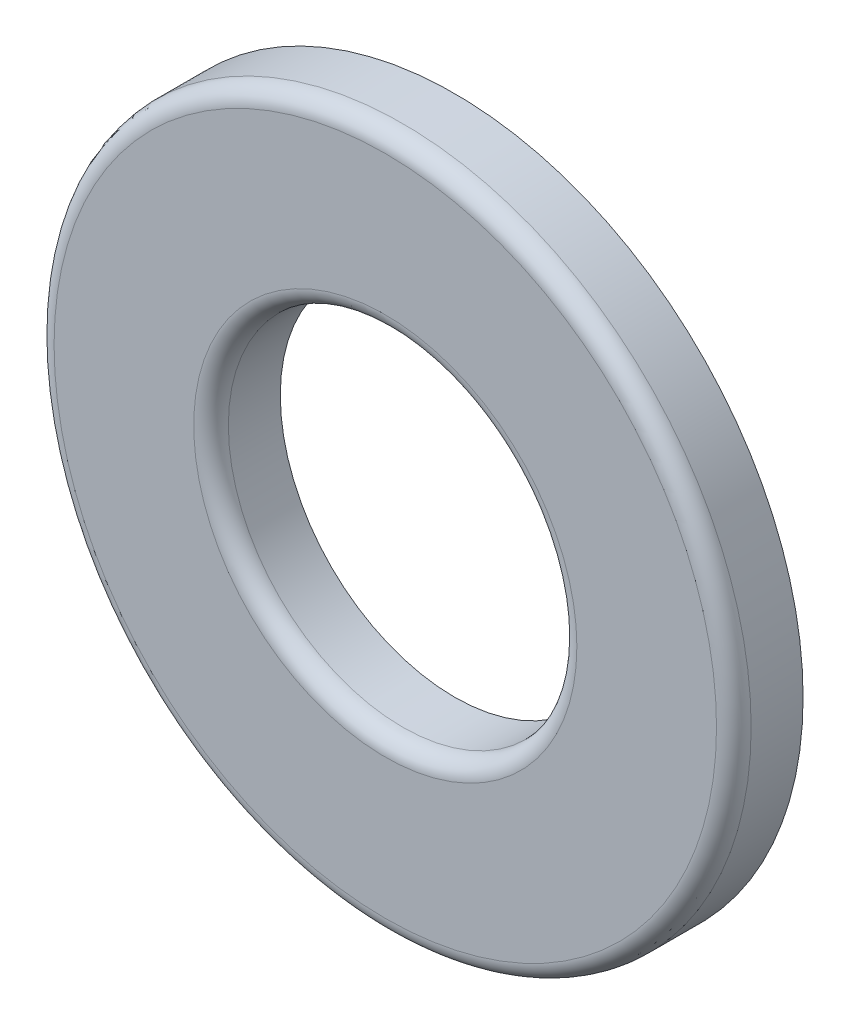
ISO-10303-21;
HEADER;
FILE_DESCRIPTION(('STEP AP214'),'2;1');
FILE_NAME('part.step','',(''),(''),'','','');
FILE_SCHEMA(('AUTOMOTIVE_DESIGN { 1 0 10303 214 1 1 1 1 }'));
ENDSEC;
DATA;
#1=APPLICATION_CONTEXT('core data for automotive mechanical design processes');
#2=APPLICATION_PROTOCOL_DEFINITION('international standard','automotive_design',2000,#1);
#3=PRODUCT_CONTEXT('',#1,'mechanical');
#4=PRODUCT('Part','Part','',(#3));
#5=PRODUCT_RELATED_PRODUCT_CATEGORY('part','',(#4));
#6=PRODUCT_DEFINITION_FORMATION('','',#4);
#7=PRODUCT_DEFINITION_CONTEXT('part definition',#1,'design');
#8=PRODUCT_DEFINITION('design','',#6,#7);
#9=PRODUCT_DEFINITION_SHAPE('','',#8);
#10=(LENGTH_UNIT() NAMED_UNIT(*) SI_UNIT(.MILLI.,.METRE.));
#11=(NAMED_UNIT(*) PLANE_ANGLE_UNIT() SI_UNIT($,.RADIAN.));
#12=(NAMED_UNIT(*) SI_UNIT($,.STERADIAN.) SOLID_ANGLE_UNIT());
#13=UNCERTAINTY_MEASURE_WITH_UNIT(LENGTH_MEASURE(1.E-05),#10,'distance_accuracy_value','');
#14=(GEOMETRIC_REPRESENTATION_CONTEXT(3) GLOBAL_UNCERTAINTY_ASSIGNED_CONTEXT((#13)) GLOBAL_UNIT_ASSIGNED_CONTEXT((#10,
#11,#12)) REPRESENTATION_CONTEXT('',''));
#15=CARTESIAN_POINT('',(0.,0.,0.));
#16=DIRECTION('',(0.,0.,1.));
#17=DIRECTION('',(1.,0.,0.));
#18=AXIS2_PLACEMENT_3D('',#15,#16,#17);
#19=CARTESIAN_POINT('',(0.,0.,0.393699999999996));
#20=DIRECTION('',(0.,0.,1.));
#21=DIRECTION('',(1.,0.,0.));
#22=AXIS2_PLACEMENT_3D('',#19,#20,#21);
#23=PLANE('',#22);
#24=CARTESIAN_POINT('',(0.,0.,0.393699999999996));
#25=DIRECTION('',(0.,0.,1.));
#26=DIRECTION('',(1.,0.,0.));
#27=AXIS2_PLACEMENT_3D('',#24,#25,#26);
#28=CIRCLE('',#27,3.76555);
#29=CARTESIAN_POINT('',(3.76555,0.,0.393699999999996));
#30=VERTEX_POINT('',#29);
#31=EDGE_CURVE('E46',#30,#30,#28,.T.);
#32=ORIENTED_EDGE('',*,*,#31,.T.);
#33=EDGE_LOOP('',(#32));
#34=FACE_BOUND('',#33,.T.);
#35=CARTESIAN_POINT('',(0.,0.,0.393699999999996));
#36=DIRECTION('',(0.,0.,1.));
#37=DIRECTION('',(1.,0.,0.));
#38=AXIS2_PLACEMENT_3D('',#35,#36,#37);
#39=CIRCLE('',#38,2.17805);
#40=CARTESIAN_POINT('',(2.17805,0.,0.393699999999996));
#41=VERTEX_POINT('',#40);
#42=EDGE_CURVE('E50',#41,#41,#39,.F.);
#43=ORIENTED_EDGE('',*,*,#42,.T.);
#44=EDGE_LOOP('',(#43));
#45=FACE_BOUND('',#44,.T.);
#46=ADVANCED_FACE('F35',(#34,#45),#23,.T.);
#47=CARTESIAN_POINT('',(0.,0.,0.393699999999996));
#48=DIRECTION('',(0.,0.,-1.));
#49=DIRECTION('',(-1.,0.,0.));
#50=AXIS2_PLACEMENT_3D('',#47,#48,#49);
#51=CYLINDRICAL_SURFACE('',#50,3.9624);
#52=CARTESIAN_POINT('',(0.,0.,0.196849999999996));
#53=DIRECTION('',(0.,0.,1.));
#54=DIRECTION('',(1.,0.,0.));
#55=AXIS2_PLACEMENT_3D('',#52,#53,#54);
#56=CIRCLE('',#55,3.9624);
#57=CARTESIAN_POINT('',(3.9624,0.,0.196849999999996));
#58=VERTEX_POINT('',#57);
#59=EDGE_CURVE('E42',#58,#58,#56,.F.);
#60=ORIENTED_EDGE('',*,*,#59,.T.);
#61=EDGE_LOOP('',(#60));
#62=FACE_BOUND('',#61,.T.);
#63=CARTESIAN_POINT('',(0.,0.,-0.393700000000004));
#64=DIRECTION('',(0.,0.,1.));
#65=DIRECTION('',(1.,0.,0.));
#66=AXIS2_PLACEMENT_3D('',#63,#64,#65);
#67=CIRCLE('',#66,3.9624);
#68=CARTESIAN_POINT('',(3.9624,0.,-0.393700000000004));
#69=VERTEX_POINT('',#68);
#70=EDGE_CURVE('E55',#69,#69,#67,.T.);
#71=ORIENTED_EDGE('',*,*,#70,.T.);
#72=EDGE_LOOP('',(#71));
#73=FACE_BOUND('',#72,.T.);
#74=ADVANCED_FACE('F67',(#62,#73),#51,.T.);
#75=CARTESIAN_POINT('',(0.,0.,0.393699999999996));
#76=DIRECTION('',(0.,0.,-1.));
#77=DIRECTION('',(-1.,0.,0.));
#78=AXIS2_PLACEMENT_3D('',#75,#76,#77);
#79=CYLINDRICAL_SURFACE('',#78,1.9812);
#80=CARTESIAN_POINT('',(0.,0.,0.196849999999996));
#81=DIRECTION('',(0.,0.,1.));
#82=DIRECTION('',(1.,0.,0.));
#83=AXIS2_PLACEMENT_3D('',#80,#81,#82);
#84=CIRCLE('',#83,1.9812);
#85=CARTESIAN_POINT('',(1.9812,0.,0.196849999999996));
#86=VERTEX_POINT('',#85);
#87=EDGE_CURVE('E10',#86,#86,#84,.T.);
#88=ORIENTED_EDGE('',*,*,#87,.T.);
#89=EDGE_LOOP('',(#88));
#90=FACE_BOUND('',#89,.T.);
#91=CARTESIAN_POINT('',(0.,0.,-0.393700000000004));
#92=DIRECTION('',(0.,0.,1.));
#93=DIRECTION('',(1.,0.,0.));
#94=AXIS2_PLACEMENT_3D('',#91,#92,#93);
#95=CIRCLE('',#94,1.9812);
#96=CARTESIAN_POINT('',(1.9812,0.,-0.393700000000004));
#97=VERTEX_POINT('',#96);
#98=EDGE_CURVE('E58',#97,#97,#95,.T.);
#99=ORIENTED_EDGE('',*,*,#98,.F.);
#100=EDGE_LOOP('',(#99));
#101=FACE_BOUND('',#100,.T.);
#102=ADVANCED_FACE('F65',(#90,#101),#79,.F.);
#103=CARTESIAN_POINT('',(0.,0.,-0.393700000000004));
#104=DIRECTION('',(0.,0.,1.));
#105=DIRECTION('',(1.,0.,0.));
#106=AXIS2_PLACEMENT_3D('',#103,#104,#105);
#107=PLANE('',#106);
#108=ORIENTED_EDGE('',*,*,#98,.T.);
#109=EDGE_LOOP('',(#108));
#110=FACE_BOUND('',#109,.T.);
#111=ORIENTED_EDGE('',*,*,#70,.F.);
#112=EDGE_LOOP('',(#111));
#113=FACE_BOUND('',#112,.T.);
#114=ADVANCED_FACE('F62',(#110,#113),#107,.F.);
#115=CARTESIAN_POINT('',(0.,0.,0.196849999999996));
#116=DIRECTION('',(0.,0.,1.));
#117=DIRECTION('',(1.,0.,0.));
#118=AXIS2_PLACEMENT_3D('',#115,#116,#117);
#119=TOROIDAL_SURFACE('',#118,3.76555,0.19685);
#120=ORIENTED_EDGE('',*,*,#59,.F.);
#121=EDGE_LOOP('',(#120));
#122=FACE_BOUND('',#121,.T.);
#123=ORIENTED_EDGE('',*,*,#31,.F.);
#124=EDGE_LOOP('',(#123));
#125=FACE_BOUND('',#124,.T.);
#126=ADVANCED_FACE('F73',(#122,#125),#119,.T.);
#127=CARTESIAN_POINT('',(0.,0.,0.196849999999996));
#128=DIRECTION('',(0.,0.,1.));
#129=DIRECTION('',(1.,0.,0.));
#130=AXIS2_PLACEMENT_3D('',#127,#128,#129);
#131=TOROIDAL_SURFACE('',#130,2.17805,0.19685);
#132=ORIENTED_EDGE('',*,*,#42,.F.);
#133=EDGE_LOOP('',(#132));
#134=FACE_BOUND('',#133,.T.);
#135=ORIENTED_EDGE('',*,*,#87,.F.);
#136=EDGE_LOOP('',(#135));
#137=FACE_BOUND('',#136,.T.);
#138=ADVANCED_FACE('F37',(#134,#137),#131,.T.);
#139=CLOSED_SHELL('',(#46,#74,#102,#114,#126,#138));
#140=MANIFOLD_SOLID_BREP('B2',#139);
#141=ADVANCED_BREP_SHAPE_REPRESENTATION('',(#18,#140),#14);
#142=SHAPE_DEFINITION_REPRESENTATION(#9,#141);
ENDSEC;
END-ISO-10303-21;
